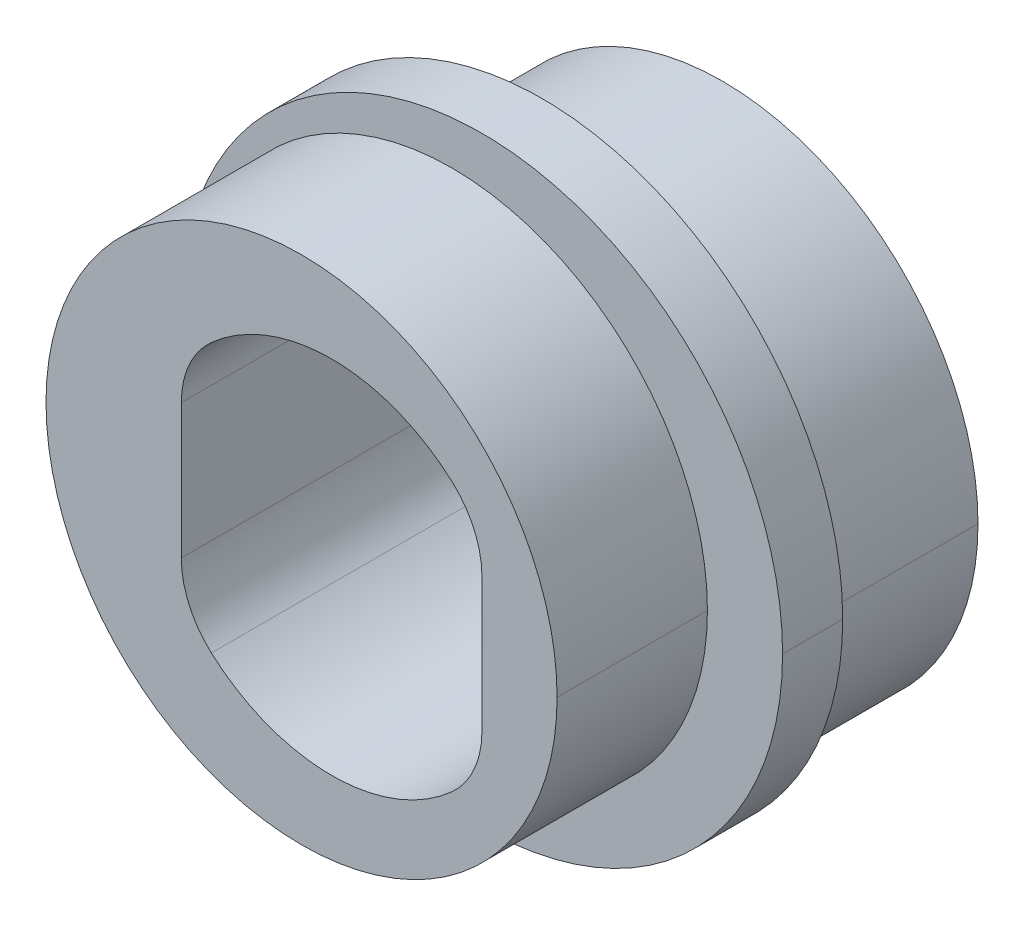
ISO-10303-21;
HEADER;
FILE_DESCRIPTION(('STEP AP214'),'2;1');
FILE_NAME('part.step','',(''),(''),'','','');
FILE_SCHEMA(('AUTOMOTIVE_DESIGN { 1 0 10303 214 1 1 1 1 }'));
ENDSEC;
DATA;
#1=APPLICATION_CONTEXT('core data for automotive mechanical design processes');
#2=APPLICATION_PROTOCOL_DEFINITION('international standard','automotive_design',2000,#1);
#3=PRODUCT_CONTEXT('',#1,'mechanical');
#4=PRODUCT('Part','Part','',(#3));
#5=PRODUCT_RELATED_PRODUCT_CATEGORY('part','',(#4));
#6=PRODUCT_DEFINITION_FORMATION('','',#4);
#7=PRODUCT_DEFINITION_CONTEXT('part definition',#1,'design');
#8=PRODUCT_DEFINITION('design','',#6,#7);
#9=PRODUCT_DEFINITION_SHAPE('','',#8);
#10=(LENGTH_UNIT() NAMED_UNIT(*) SI_UNIT(.MILLI.,.METRE.));
#11=(NAMED_UNIT(*) PLANE_ANGLE_UNIT() SI_UNIT($,.RADIAN.));
#12=(NAMED_UNIT(*) SI_UNIT($,.STERADIAN.) SOLID_ANGLE_UNIT());
#13=UNCERTAINTY_MEASURE_WITH_UNIT(LENGTH_MEASURE(1.E-05),#10,'distance_accuracy_value','');
#14=(GEOMETRIC_REPRESENTATION_CONTEXT(3) GLOBAL_UNCERTAINTY_ASSIGNED_CONTEXT((#13)) GLOBAL_UNIT_ASSIGNED_CONTEXT((#10,
#11,#12)) REPRESENTATION_CONTEXT('',''));
#15=CARTESIAN_POINT('',(0.,0.,0.));
#16=DIRECTION('',(0.,0.,1.));
#17=DIRECTION('',(1.,0.,0.));
#18=AXIS2_PLACEMENT_3D('',#15,#16,#17);
#19=CARTESIAN_POINT('',(-2.,2.23606797749979,5.));
#20=DIRECTION('',(0.,0.,-1.));
#21=DIRECTION('',(-1.,0.,0.));
#22=AXIS2_PLACEMENT_3D('',#19,#20,#21);
#23=CYLINDRICAL_SURFACE('',#22,3.);
#24=CARTESIAN_POINT('',(-2.,2.23606797749979,5.));
#25=DIRECTION('',(0.,0.,-1.));
#26=DIRECTION('',(1.,0.,0.));
#27=AXIS2_PLACEMENT_3D('',#24,#25,#26);
#28=CIRCLE('',#27,3.);
#29=CARTESIAN_POINT('',(-5.,2.23606797749979,5.));
#30=VERTEX_POINT('',#29);
#31=CARTESIAN_POINT('',(-4.,4.47213595499958,5.));
#32=VERTEX_POINT('',#31);
#33=EDGE_CURVE('E158',#30,#32,#28,.T.);
#34=ORIENTED_EDGE('',*,*,#33,.F.);
#35=DIRECTION('',(0.,0.,1.));
#36=VECTOR('',#35,1.);
#37=CARTESIAN_POINT('',(-5.,2.23606797749979,5.));
#38=LINE('',#37,#36);
#39=CARTESIAN_POINT('',(-5.,2.23606797749979,-7.));
#40=VERTEX_POINT('',#39);
#41=EDGE_CURVE('E219',#40,#30,#38,.T.);
#42=ORIENTED_EDGE('',*,*,#41,.F.);
#43=CARTESIAN_POINT('',(-2.,2.23606797749979,-7.));
#44=DIRECTION('',(0.,0.,1.));
#45=DIRECTION('',(-1.,0.,0.));
#46=AXIS2_PLACEMENT_3D('',#43,#44,#45);
#47=CIRCLE('',#46,3.);
#48=CARTESIAN_POINT('',(-4.,4.47213595499958,-7.));
#49=VERTEX_POINT('',#48);
#50=EDGE_CURVE('E159',#49,#40,#47,.T.);
#51=ORIENTED_EDGE('',*,*,#50,.F.);
#52=DIRECTION('',(0.,0.,-1.));
#53=VECTOR('',#52,1.);
#54=CARTESIAN_POINT('',(-4.,4.47213595499958,5.));
#55=LINE('',#54,#53);
#56=EDGE_CURVE('E152',#32,#49,#55,.T.);
#57=ORIENTED_EDGE('',*,*,#56,.F.);
#58=EDGE_LOOP('',(#34,#42,#51,#57));
#59=FACE_BOUND('',#58,.T.);
#60=ADVANCED_FACE('F17',(#59),#23,.F.);
#61=CARTESIAN_POINT('',(-2.,-2.23606797749979,5.));
#62=DIRECTION('',(0.,0.,-1.));
#63=DIRECTION('',(-1.,0.,0.));
#64=AXIS2_PLACEMENT_3D('',#61,#62,#63);
#65=CYLINDRICAL_SURFACE('',#64,3.);
#66=CARTESIAN_POINT('',(-2.,-2.23606797749979,5.));
#67=DIRECTION('',(0.,0.,-1.));
#68=DIRECTION('',(1.,0.,0.));
#69=AXIS2_PLACEMENT_3D('',#66,#67,#68);
#70=CIRCLE('',#69,3.);
#71=CARTESIAN_POINT('',(-4.,-4.47213595499958,5.));
#72=VERTEX_POINT('',#71);
#73=CARTESIAN_POINT('',(-5.,-2.23606797749979,5.));
#74=VERTEX_POINT('',#73);
#75=EDGE_CURVE('E205',#72,#74,#70,.T.);
#76=ORIENTED_EDGE('',*,*,#75,.F.);
#77=DIRECTION('',(0.,0.,1.));
#78=VECTOR('',#77,1.);
#79=CARTESIAN_POINT('',(-4.,-4.47213595499958,5.));
#80=LINE('',#79,#78);
#81=CARTESIAN_POINT('',(-4.,-4.47213595499958,-7.));
#82=VERTEX_POINT('',#81);
#83=EDGE_CURVE('E230',#82,#72,#80,.T.);
#84=ORIENTED_EDGE('',*,*,#83,.F.);
#85=CARTESIAN_POINT('',(-2.,-2.23606797749979,-7.));
#86=DIRECTION('',(0.,0.,1.));
#87=DIRECTION('',(-1.,0.,0.));
#88=AXIS2_PLACEMENT_3D('',#85,#86,#87);
#89=CIRCLE('',#88,3.);
#90=CARTESIAN_POINT('',(-5.,-2.23606797749979,-7.));
#91=VERTEX_POINT('',#90);
#92=EDGE_CURVE('E250',#91,#82,#89,.T.);
#93=ORIENTED_EDGE('',*,*,#92,.F.);
#94=DIRECTION('',(0.,0.,-1.));
#95=VECTOR('',#94,1.);
#96=CARTESIAN_POINT('',(-5.,-2.23606797749979,-7.));
#97=LINE('',#96,#95);
#98=EDGE_CURVE('E164',#74,#91,#97,.T.);
#99=ORIENTED_EDGE('',*,*,#98,.F.);
#100=EDGE_LOOP('',(#76,#84,#93,#99));
#101=FACE_BOUND('',#100,.T.);
#102=ADVANCED_FACE('F343',(#101),#65,.F.);
#103=CARTESIAN_POINT('',(2.,-2.23606797749979,5.));
#104=DIRECTION('',(0.,0.,-1.));
#105=DIRECTION('',(-1.,0.,0.));
#106=AXIS2_PLACEMENT_3D('',#103,#104,#105);
#107=CYLINDRICAL_SURFACE('',#106,3.);
#108=CARTESIAN_POINT('',(2.,-2.23606797749979,5.));
#109=DIRECTION('',(0.,0.,-1.));
#110=DIRECTION('',(1.,0.,0.));
#111=AXIS2_PLACEMENT_3D('',#108,#109,#110);
#112=CIRCLE('',#111,3.);
#113=CARTESIAN_POINT('',(5.,-2.23606797749979,5.));
#114=VERTEX_POINT('',#113);
#115=CARTESIAN_POINT('',(4.,-4.47213595499958,5.));
#116=VERTEX_POINT('',#115);
#117=EDGE_CURVE('E197',#114,#116,#112,.T.);
#118=ORIENTED_EDGE('',*,*,#117,.F.);
#119=DIRECTION('',(0.,0.,1.));
#120=VECTOR('',#119,1.);
#121=CARTESIAN_POINT('',(5.,-2.23606797749979,5.));
#122=LINE('',#121,#120);
#123=CARTESIAN_POINT('',(5.,-2.23606797749979,-7.));
#124=VERTEX_POINT('',#123);
#125=EDGE_CURVE('E238',#124,#114,#122,.T.);
#126=ORIENTED_EDGE('',*,*,#125,.F.);
#127=CARTESIAN_POINT('',(2.,-2.23606797749979,-7.));
#128=DIRECTION('',(0.,0.,1.));
#129=DIRECTION('',(-1.,0.,0.));
#130=AXIS2_PLACEMENT_3D('',#127,#128,#129);
#131=CIRCLE('',#130,3.);
#132=CARTESIAN_POINT('',(4.,-4.47213595499958,-7.));
#133=VERTEX_POINT('',#132);
#134=EDGE_CURVE('E36',#133,#124,#131,.T.);
#135=ORIENTED_EDGE('',*,*,#134,.F.);
#136=DIRECTION('',(0.,0.,-1.));
#137=VECTOR('',#136,1.);
#138=CARTESIAN_POINT('',(4.,-4.47213595499958,5.));
#139=LINE('',#138,#137);
#140=EDGE_CURVE('E224',#116,#133,#139,.T.);
#141=ORIENTED_EDGE('',*,*,#140,.F.);
#142=EDGE_LOOP('',(#118,#126,#135,#141));
#143=FACE_BOUND('',#142,.T.);
#144=ADVANCED_FACE('F338',(#143),#107,.F.);
#145=CARTESIAN_POINT('',(2.,2.23606797749979,5.));
#146=DIRECTION('',(0.,0.,-1.));
#147=DIRECTION('',(-1.,0.,0.));
#148=AXIS2_PLACEMENT_3D('',#145,#146,#147);
#149=CYLINDRICAL_SURFACE('',#148,3.);
#150=CARTESIAN_POINT('',(2.,2.23606797749979,5.));
#151=DIRECTION('',(0.,0.,-1.));
#152=DIRECTION('',(1.,0.,0.));
#153=AXIS2_PLACEMENT_3D('',#150,#151,#152);
#154=CIRCLE('',#153,3.);
#155=CARTESIAN_POINT('',(4.,4.47213595499958,5.));
#156=VERTEX_POINT('',#155);
#157=CARTESIAN_POINT('',(5.,2.23606797749979,5.));
#158=VERTEX_POINT('',#157);
#159=EDGE_CURVE('E175',#156,#158,#154,.T.);
#160=ORIENTED_EDGE('',*,*,#159,.F.);
#161=DIRECTION('',(0.,0.,1.));
#162=VECTOR('',#161,1.);
#163=CARTESIAN_POINT('',(4.,4.47213595499958,5.));
#164=LINE('',#163,#162);
#165=CARTESIAN_POINT('',(4.,4.47213595499958,-7.));
#166=VERTEX_POINT('',#165);
#167=EDGE_CURVE('E167',#166,#156,#164,.T.);
#168=ORIENTED_EDGE('',*,*,#167,.F.);
#169=CARTESIAN_POINT('',(2.,2.23606797749979,-7.));
#170=DIRECTION('',(0.,0.,1.));
#171=DIRECTION('',(-1.,0.,0.));
#172=AXIS2_PLACEMENT_3D('',#169,#170,#171);
#173=CIRCLE('',#172,3.);
#174=CARTESIAN_POINT('',(5.,2.23606797749979,-7.));
#175=VERTEX_POINT('',#174);
#176=EDGE_CURVE('E47',#175,#166,#173,.T.);
#177=ORIENTED_EDGE('',*,*,#176,.F.);
#178=DIRECTION('',(0.,0.,-1.));
#179=VECTOR('',#178,1.);
#180=CARTESIAN_POINT('',(5.,2.23606797749979,-7.));
#181=LINE('',#180,#179);
#182=EDGE_CURVE('E234',#158,#175,#181,.T.);
#183=ORIENTED_EDGE('',*,*,#182,.F.);
#184=EDGE_LOOP('',(#160,#168,#177,#183));
#185=FACE_BOUND('',#184,.T.);
#186=ADVANCED_FACE('F375',(#185),#149,.F.);
#187=CARTESIAN_POINT('',(0.,0.,-2.));
#188=DIRECTION('',(0.,0.,1.));
#189=DIRECTION('',(1.,0.,0.));
#190=AXIS2_PLACEMENT_3D('',#187,#188,#189);
#191=CYLINDRICAL_SURFACE('',#190,10.);
#192=DIRECTION('',(0.,0.,1.));
#193=VECTOR('',#192,1.);
#194=CARTESIAN_POINT('',(-10.,0.,-2.));
#195=LINE('',#194,#193);
#196=CARTESIAN_POINT('',(-10.,0.,-2.));
#197=VERTEX_POINT('',#196);
#198=CARTESIAN_POINT('',(-10.,0.,0.));
#199=VERTEX_POINT('',#198);
#200=EDGE_CURVE('E321',#197,#199,#195,.T.);
#201=ORIENTED_EDGE('',*,*,#200,.F.);
#202=CARTESIAN_POINT('',(0.,0.,-2.));
#203=DIRECTION('',(0.,0.,-1.));
#204=DIRECTION('',(-1.,0.,0.));
#205=AXIS2_PLACEMENT_3D('',#202,#203,#204);
#206=CIRCLE('',#205,10.);
#207=CARTESIAN_POINT('',(10.,0.,-2.));
#208=VERTEX_POINT('',#207);
#209=EDGE_CURVE('E11',#208,#197,#206,.T.);
#210=ORIENTED_EDGE('',*,*,#209,.F.);
#211=DIRECTION('',(0.,0.,1.));
#212=VECTOR('',#211,1.);
#213=CARTESIAN_POINT('',(10.,0.,-2.));
#214=LINE('',#213,#212);
#215=CARTESIAN_POINT('',(10.,0.,0.));
#216=VERTEX_POINT('',#215);
#217=EDGE_CURVE('E285',#208,#216,#214,.T.);
#218=ORIENTED_EDGE('',*,*,#217,.T.);
#219=CARTESIAN_POINT('',(0.,0.,0.));
#220=DIRECTION('',(0.,0.,-1.));
#221=DIRECTION('',(-1.,0.,0.));
#222=AXIS2_PLACEMENT_3D('',#219,#220,#221);
#223=CIRCLE('',#222,10.);
#224=EDGE_CURVE('E241',#216,#199,#223,.T.);
#225=ORIENTED_EDGE('',*,*,#224,.T.);
#226=EDGE_LOOP('',(#201,#210,#218,#225));
#227=FACE_BOUND('',#226,.T.);
#228=ADVANCED_FACE('F381',(#227),#191,.T.);
#229=CARTESIAN_POINT('',(0.,0.,-2.));
#230=DIRECTION('',(0.,0.,-1.));
#231=DIRECTION('',(0.,-1.,0.));
#232=AXIS2_PLACEMENT_3D('',#229,#230,#231);
#233=PLANE('',#232);
#234=CARTESIAN_POINT('',(1.,0.,-2.));
#235=DIRECTION('',(0.,0.,-1.));
#236=DIRECTION('',(-1.,0.,0.));
#237=AXIS2_PLACEMENT_3D('',#234,#235,#236);
#238=CIRCLE('',#237,8.5);
#239=CARTESIAN_POINT('',(9.5,0.,-2.));
#240=VERTEX_POINT('',#239);
#241=CARTESIAN_POINT('',(-7.5,0.,-2.));
#242=VERTEX_POINT('',#241);
#243=EDGE_CURVE('E25',#240,#242,#238,.T.);
#244=ORIENTED_EDGE('',*,*,#243,.F.);
#245=CARTESIAN_POINT('',(1.,0.,-2.));
#246=DIRECTION('',(0.,0.,-1.));
#247=DIRECTION('',(-1.,0.,0.));
#248=AXIS2_PLACEMENT_3D('',#245,#246,#247);
#249=CIRCLE('',#248,8.5);
#250=EDGE_CURVE('E269',#242,#240,#249,.T.);
#251=ORIENTED_EDGE('',*,*,#250,.F.);
#252=EDGE_LOOP('',(#244,#251));
#253=FACE_BOUND('',#252,.T.);
#254=ORIENTED_EDGE('',*,*,#209,.T.);
#255=CARTESIAN_POINT('',(0.,0.,-2.));
#256=DIRECTION('',(0.,0.,-1.));
#257=DIRECTION('',(-1.,0.,0.));
#258=AXIS2_PLACEMENT_3D('',#255,#256,#257);
#259=CIRCLE('',#258,10.);
#260=EDGE_CURVE('E637',#197,#208,#259,.T.);
#261=ORIENTED_EDGE('',*,*,#260,.T.);
#262=EDGE_LOOP('',(#254,#261));
#263=FACE_BOUND('',#262,.T.);
#264=ADVANCED_FACE('F271',(#253,#263),#233,.T.);
#265=CARTESIAN_POINT('',(1.,0.,-7.));
#266=DIRECTION('',(0.,0.,1.));
#267=DIRECTION('',(1.,0.,0.));
#268=AXIS2_PLACEMENT_3D('',#265,#266,#267);
#269=CYLINDRICAL_SURFACE('',#268,8.5);
#270=DIRECTION('',(0.,0.,1.));
#271=VECTOR('',#270,1.);
#272=CARTESIAN_POINT('',(-7.5,0.,-7.));
#273=LINE('',#272,#271);
#274=CARTESIAN_POINT('',(-7.5,0.,-7.));
#275=VERTEX_POINT('',#274);
#276=EDGE_CURVE('E262',#275,#242,#273,.T.);
#277=ORIENTED_EDGE('',*,*,#276,.F.);
#278=CARTESIAN_POINT('',(1.,0.,-7.));
#279=DIRECTION('',(0.,0.,-1.));
#280=DIRECTION('',(-1.,0.,0.));
#281=AXIS2_PLACEMENT_3D('',#278,#279,#280);
#282=CIRCLE('',#281,8.5);
#283=CARTESIAN_POINT('',(9.5,0.,-7.));
#284=VERTEX_POINT('',#283);
#285=EDGE_CURVE('E243',#284,#275,#282,.T.);
#286=ORIENTED_EDGE('',*,*,#285,.F.);
#287=DIRECTION('',(0.,0.,1.));
#288=VECTOR('',#287,1.);
#289=CARTESIAN_POINT('',(9.5,0.,-7.));
#290=LINE('',#289,#288);
#291=EDGE_CURVE('E270',#284,#240,#290,.T.);
#292=ORIENTED_EDGE('',*,*,#291,.T.);
#293=ORIENTED_EDGE('',*,*,#243,.T.);
#294=EDGE_LOOP('',(#277,#286,#292,#293));
#295=FACE_BOUND('',#294,.T.);
#296=ADVANCED_FACE('F265',(#295),#269,.T.);
#297=CARTESIAN_POINT('',(1.,0.,-7.));
#298=DIRECTION('',(0.,0.,-1.));
#299=DIRECTION('',(0.,-1.,0.));
#300=AXIS2_PLACEMENT_3D('',#297,#298,#299);
#301=PLANE('',#300);
#302=DIRECTION('',(0.,-1.,0.));
#303=VECTOR('',#302,1.);
#304=CARTESIAN_POINT('',(-5.,3.3166247903554,-7.));
#305=LINE('',#304,#303);
#306=EDGE_CURVE('E216',#40,#91,#305,.T.);
#307=ORIENTED_EDGE('',*,*,#306,.T.);
#308=ORIENTED_EDGE('',*,*,#92,.T.);
#309=CARTESIAN_POINT('',(0.,0.,-7.));
#310=DIRECTION('',(0.,0.,1.));
#311=DIRECTION('',(1.,0.,0.));
#312=AXIS2_PLACEMENT_3D('',#309,#310,#311);
#313=CIRCLE('',#312,6.);
#314=EDGE_CURVE('E227',#82,#133,#313,.T.);
#315=ORIENTED_EDGE('',*,*,#314,.T.);
#316=ORIENTED_EDGE('',*,*,#134,.T.);
#317=DIRECTION('',(0.,1.,0.));
#318=VECTOR('',#317,1.);
#319=CARTESIAN_POINT('',(5.,-3.3166247903554,-7.));
#320=LINE('',#319,#318);
#321=EDGE_CURVE('E236',#124,#175,#320,.T.);
#322=ORIENTED_EDGE('',*,*,#321,.T.);
#323=ORIENTED_EDGE('',*,*,#176,.T.);
#324=CARTESIAN_POINT('',(0.,0.,-7.));
#325=DIRECTION('',(0.,0.,1.));
#326=DIRECTION('',(1.,0.,0.));
#327=AXIS2_PLACEMENT_3D('',#324,#325,#326);
#328=CIRCLE('',#327,6.);
#329=EDGE_CURVE('E208',#166,#49,#328,.T.);
#330=ORIENTED_EDGE('',*,*,#329,.T.);
#331=ORIENTED_EDGE('',*,*,#50,.T.);
#332=EDGE_LOOP('',(#307,#308,#315,#316,#322,#323,#330,#331));
#333=FACE_BOUND('',#332,.T.);
#334=ORIENTED_EDGE('',*,*,#285,.T.);
#335=CARTESIAN_POINT('',(1.,0.,-7.));
#336=DIRECTION('',(0.,0.,-1.));
#337=DIRECTION('',(-1.,0.,0.));
#338=AXIS2_PLACEMENT_3D('',#335,#336,#337);
#339=CIRCLE('',#338,8.5);
#340=EDGE_CURVE('E279',#275,#284,#339,.T.);
#341=ORIENTED_EDGE('',*,*,#340,.T.);
#342=EDGE_LOOP('',(#334,#341));
#343=FACE_BOUND('',#342,.T.);
#344=ADVANCED_FACE('F342',(#333,#343),#301,.T.);
#345=CARTESIAN_POINT('',(1.,0.,0.));
#346=DIRECTION('',(0.,0.,-1.));
#347=DIRECTION('',(0.,-1.,0.));
#348=AXIS2_PLACEMENT_3D('',#345,#346,#347);
#349=PLANE('',#348);
#350=CARTESIAN_POINT('',(-1.,0.,0.));
#351=DIRECTION('',(0.,0.,1.));
#352=DIRECTION('',(1.,0.,0.));
#353=AXIS2_PLACEMENT_3D('',#350,#351,#352);
#354=CIRCLE('',#353,8.5);
#355=CARTESIAN_POINT('',(-9.5,0.,0.));
#356=VERTEX_POINT('',#355);
#357=CARTESIAN_POINT('',(7.5,0.,0.));
#358=VERTEX_POINT('',#357);
#359=EDGE_CURVE('E202',#356,#358,#354,.T.);
#360=ORIENTED_EDGE('',*,*,#359,.F.);
#361=CARTESIAN_POINT('',(-1.,0.,0.));
#362=DIRECTION('',(0.,0.,1.));
#363=DIRECTION('',(1.,0.,0.));
#364=AXIS2_PLACEMENT_3D('',#361,#362,#363);
#365=CIRCLE('',#364,8.5);
#366=EDGE_CURVE('E298',#358,#356,#365,.T.);
#367=ORIENTED_EDGE('',*,*,#366,.F.);
#368=EDGE_LOOP('',(#360,#367));
#369=FACE_BOUND('',#368,.T.);
#370=ORIENTED_EDGE('',*,*,#224,.F.);
#371=CARTESIAN_POINT('',(0.,0.,0.));
#372=DIRECTION('',(0.,0.,-1.));
#373=DIRECTION('',(-1.,0.,0.));
#374=AXIS2_PLACEMENT_3D('',#371,#372,#373);
#375=CIRCLE('',#374,10.);
#376=EDGE_CURVE('E318',#199,#216,#375,.T.);
#377=ORIENTED_EDGE('',*,*,#376,.F.);
#378=EDGE_LOOP('',(#370,#377));
#379=FACE_BOUND('',#378,.T.);
#380=ADVANCED_FACE('F374',(#369,#379),#349,.F.);
#381=CARTESIAN_POINT('',(5.,-3.3166247903554,5.));
#382=DIRECTION('',(-1.,0.,0.));
#383=DIRECTION('',(0.,0.,1.));
#384=AXIS2_PLACEMENT_3D('',#381,#382,#383);
#385=PLANE('',#384);
#386=DIRECTION('',(0.,1.,0.));
#387=VECTOR('',#386,1.);
#388=CARTESIAN_POINT('',(5.,-3.3166247903554,5.));
#389=LINE('',#388,#387);
#390=EDGE_CURVE('E194',#114,#158,#389,.T.);
#391=ORIENTED_EDGE('',*,*,#390,.T.);
#392=ORIENTED_EDGE('',*,*,#182,.T.);
#393=ORIENTED_EDGE('',*,*,#321,.F.);
#394=ORIENTED_EDGE('',*,*,#125,.T.);
#395=EDGE_LOOP('',(#391,#392,#393,#394));
#396=FACE_BOUND('',#395,.T.);
#397=ADVANCED_FACE('F359',(#396),#385,.T.);
#398=CARTESIAN_POINT('',(0.,0.,5.));
#399=DIRECTION('',(0.,0.,-1.));
#400=DIRECTION('',(-1.,0.,0.));
#401=AXIS2_PLACEMENT_3D('',#398,#399,#400);
#402=CYLINDRICAL_SURFACE('',#401,6.);
#403=CARTESIAN_POINT('',(0.,0.,5.));
#404=DIRECTION('',(0.,0.,1.));
#405=DIRECTION('',(1.,0.,0.));
#406=AXIS2_PLACEMENT_3D('',#403,#404,#405);
#407=CIRCLE('',#406,6.);
#408=EDGE_CURVE('E203',#72,#116,#407,.T.);
#409=ORIENTED_EDGE('',*,*,#408,.T.);
#410=ORIENTED_EDGE('',*,*,#140,.T.);
#411=ORIENTED_EDGE('',*,*,#314,.F.);
#412=ORIENTED_EDGE('',*,*,#83,.T.);
#413=EDGE_LOOP('',(#409,#410,#411,#412));
#414=FACE_BOUND('',#413,.T.);
#415=ADVANCED_FACE('F335',(#414),#402,.F.);
#416=CARTESIAN_POINT('',(-5.,-3.3166247903554,5.));
#417=DIRECTION('',(1.,0.,0.));
#418=DIRECTION('',(0.,1.,0.));
#419=AXIS2_PLACEMENT_3D('',#416,#417,#418);
#420=PLANE('',#419);
#421=DIRECTION('',(0.,-1.,0.));
#422=VECTOR('',#421,1.);
#423=CARTESIAN_POINT('',(-5.,-3.3166247903554,5.));
#424=LINE('',#423,#422);
#425=EDGE_CURVE('E185',#30,#74,#424,.T.);
#426=ORIENTED_EDGE('',*,*,#425,.T.);
#427=ORIENTED_EDGE('',*,*,#98,.T.);
#428=ORIENTED_EDGE('',*,*,#306,.F.);
#429=ORIENTED_EDGE('',*,*,#41,.T.);
#430=EDGE_LOOP('',(#426,#427,#428,#429));
#431=FACE_BOUND('',#430,.T.);
#432=ADVANCED_FACE('F346',(#431),#420,.T.);
#433=CARTESIAN_POINT('',(0.,0.,5.));
#434=DIRECTION('',(0.,0.,-1.));
#435=DIRECTION('',(-1.,0.,0.));
#436=AXIS2_PLACEMENT_3D('',#433,#434,#435);
#437=CYLINDRICAL_SURFACE('',#436,6.);
#438=ORIENTED_EDGE('',*,*,#329,.F.);
#439=ORIENTED_EDGE('',*,*,#167,.T.);
#440=CARTESIAN_POINT('',(0.,0.,5.));
#441=DIRECTION('',(0.,0.,1.));
#442=DIRECTION('',(1.,0.,0.));
#443=AXIS2_PLACEMENT_3D('',#440,#441,#442);
#444=CIRCLE('',#443,6.);
#445=EDGE_CURVE('E166',#156,#32,#444,.T.);
#446=ORIENTED_EDGE('',*,*,#445,.T.);
#447=ORIENTED_EDGE('',*,*,#56,.T.);
#448=EDGE_LOOP('',(#438,#439,#446,#447));
#449=FACE_BOUND('',#448,.T.);
#450=ADVANCED_FACE('F168',(#449),#437,.F.);
#451=CARTESIAN_POINT('',(-1.,0.,5.));
#452=DIRECTION('',(0.,0.,-1.));
#453=DIRECTION('',(-1.,0.,0.));
#454=AXIS2_PLACEMENT_3D('',#451,#452,#453);
#455=CYLINDRICAL_SURFACE('',#454,8.5);
#456=DIRECTION('',(0.,0.,-1.));
#457=VECTOR('',#456,1.);
#458=CARTESIAN_POINT('',(7.5,0.,5.));
#459=LINE('',#458,#457);
#460=CARTESIAN_POINT('',(7.5,0.,5.));
#461=VERTEX_POINT('',#460);
#462=EDGE_CURVE('E294',#461,#358,#459,.T.);
#463=ORIENTED_EDGE('',*,*,#462,.F.);
#464=CARTESIAN_POINT('',(-1.,0.,5.));
#465=DIRECTION('',(0.,0.,1.));
#466=DIRECTION('',(1.,0.,0.));
#467=AXIS2_PLACEMENT_3D('',#464,#465,#466);
#468=CIRCLE('',#467,8.5);
#469=CARTESIAN_POINT('',(-9.5,0.,5.));
#470=VERTEX_POINT('',#469);
#471=EDGE_CURVE('E187',#470,#461,#468,.T.);
#472=ORIENTED_EDGE('',*,*,#471,.F.);
#473=DIRECTION('',(0.,0.,-1.));
#474=VECTOR('',#473,1.);
#475=CARTESIAN_POINT('',(-9.5,0.,5.));
#476=LINE('',#475,#474);
#477=EDGE_CURVE('E288',#470,#356,#476,.T.);
#478=ORIENTED_EDGE('',*,*,#477,.T.);
#479=ORIENTED_EDGE('',*,*,#359,.T.);
#480=EDGE_LOOP('',(#463,#472,#478,#479));
#481=FACE_BOUND('',#480,.T.);
#482=ADVANCED_FACE('F357',(#481),#455,.T.);
#483=CARTESIAN_POINT('',(-1.,0.,5.));
#484=DIRECTION('',(0.,0.,1.));
#485=DIRECTION('',(1.,0.,0.));
#486=AXIS2_PLACEMENT_3D('',#483,#484,#485);
#487=PLANE('',#486);
#488=ORIENTED_EDGE('',*,*,#425,.F.);
#489=ORIENTED_EDGE('',*,*,#33,.T.);
#490=ORIENTED_EDGE('',*,*,#445,.F.);
#491=ORIENTED_EDGE('',*,*,#159,.T.);
#492=ORIENTED_EDGE('',*,*,#390,.F.);
#493=ORIENTED_EDGE('',*,*,#117,.T.);
#494=ORIENTED_EDGE('',*,*,#408,.F.);
#495=ORIENTED_EDGE('',*,*,#75,.T.);
#496=EDGE_LOOP('',(#488,#489,#490,#491,#492,#493,#494,#495));
#497=FACE_BOUND('',#496,.T.);
#498=ORIENTED_EDGE('',*,*,#471,.T.);
#499=CARTESIAN_POINT('',(-1.,0.,5.));
#500=DIRECTION('',(0.,0.,1.));
#501=DIRECTION('',(1.,0.,0.));
#502=AXIS2_PLACEMENT_3D('',#499,#500,#501);
#503=CIRCLE('',#502,8.5);
#504=EDGE_CURVE('E295',#461,#470,#503,.T.);
#505=ORIENTED_EDGE('',*,*,#504,.T.);
#506=EDGE_LOOP('',(#498,#505));
#507=FACE_BOUND('',#506,.T.);
#508=ADVANCED_FACE('F180',(#497,#507),#487,.T.);
#509=CARTESIAN_POINT('',(-1.,0.,5.));
#510=DIRECTION('',(0.,0.,-1.));
#511=DIRECTION('',(-1.,0.,0.));
#512=AXIS2_PLACEMENT_3D('',#509,#510,#511);
#513=CYLINDRICAL_SURFACE('',#512,8.5);
#514=ORIENTED_EDGE('',*,*,#504,.F.);
#515=ORIENTED_EDGE('',*,*,#462,.T.);
#516=ORIENTED_EDGE('',*,*,#366,.T.);
#517=ORIENTED_EDGE('',*,*,#477,.F.);
#518=EDGE_LOOP('',(#514,#515,#516,#517));
#519=FACE_BOUND('',#518,.T.);
#520=ADVANCED_FACE('F397',(#519),#513,.T.);
#521=CARTESIAN_POINT('',(1.,0.,-7.));
#522=DIRECTION('',(0.,0.,1.));
#523=DIRECTION('',(1.,0.,0.));
#524=AXIS2_PLACEMENT_3D('',#521,#522,#523);
#525=CYLINDRICAL_SURFACE('',#524,8.5);
#526=ORIENTED_EDGE('',*,*,#340,.F.);
#527=ORIENTED_EDGE('',*,*,#276,.T.);
#528=ORIENTED_EDGE('',*,*,#250,.T.);
#529=ORIENTED_EDGE('',*,*,#291,.F.);
#530=EDGE_LOOP('',(#526,#527,#528,#529));
#531=FACE_BOUND('',#530,.T.);
#532=ADVANCED_FACE('F277',(#531),#525,.T.);
#533=CARTESIAN_POINT('',(0.,0.,-2.));
#534=DIRECTION('',(0.,0.,1.));
#535=DIRECTION('',(1.,0.,0.));
#536=AXIS2_PLACEMENT_3D('',#533,#534,#535);
#537=CYLINDRICAL_SURFACE('',#536,10.);
#538=ORIENTED_EDGE('',*,*,#260,.F.);
#539=ORIENTED_EDGE('',*,*,#200,.T.);
#540=ORIENTED_EDGE('',*,*,#376,.T.);
#541=ORIENTED_EDGE('',*,*,#217,.F.);
#542=EDGE_LOOP('',(#538,#539,#540,#541));
#543=FACE_BOUND('',#542,.T.);
#544=ADVANCED_FACE('F405',(#543),#537,.T.);
#545=CLOSED_SHELL('',(#60,#102,#144,#186,#228,#264,#296,#344,#380,#397,#415,#432,#450,#482,#508,
#520,#532,#544));
#546=MANIFOLD_SOLID_BREP('B1',#545);
#547=ADVANCED_BREP_SHAPE_REPRESENTATION('',(#18,#546),#14);
#548=SHAPE_DEFINITION_REPRESENTATION(#9,#547);
ENDSEC;
END-ISO-10303-21;
